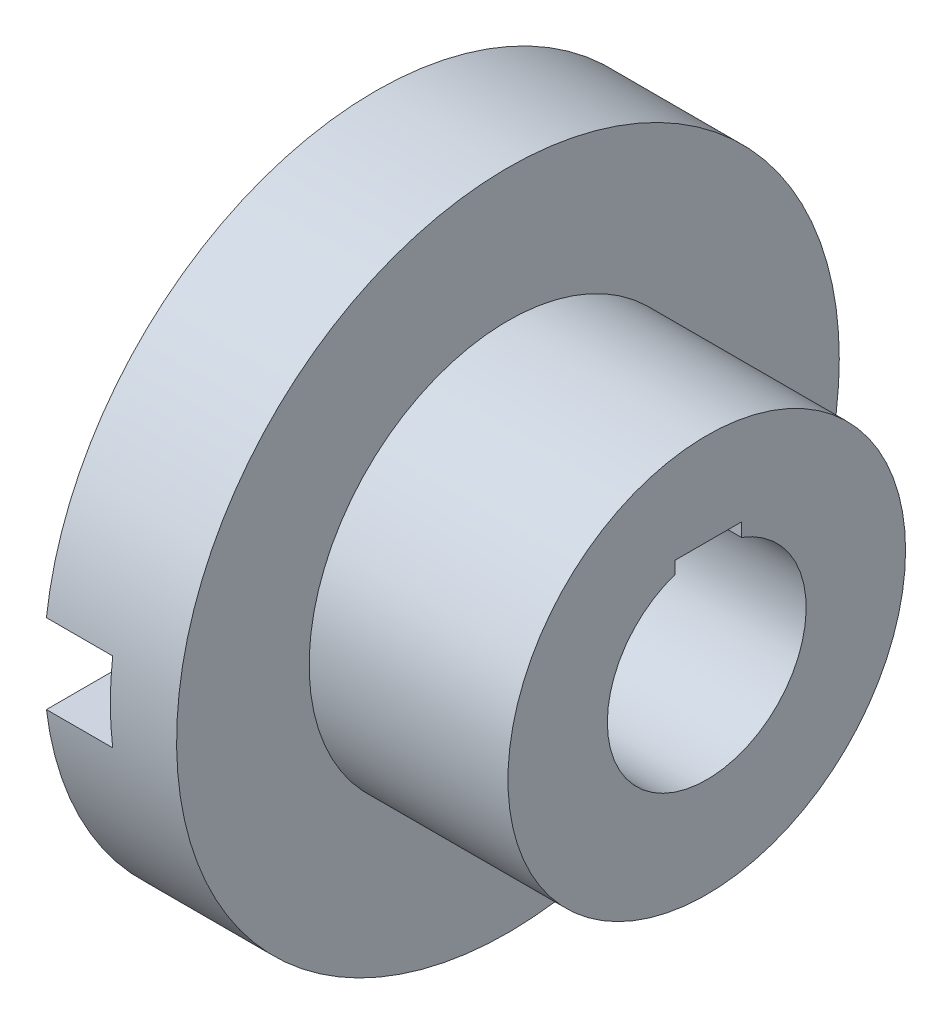
ISO-10303-21;
HEADER;
FILE_DESCRIPTION(('STEP AP214'),'2;1');
FILE_NAME('part.step','',(''),(''),'','','');
FILE_SCHEMA(('AUTOMOTIVE_DESIGN { 1 0 10303 214 1 1 1 1 }'));
ENDSEC;
DATA;
#1=APPLICATION_CONTEXT('core data for automotive mechanical design processes');
#2=APPLICATION_PROTOCOL_DEFINITION('international standard','automotive_design',2000,#1);
#3=PRODUCT_CONTEXT('',#1,'mechanical');
#4=PRODUCT('Part','Part','',(#3));
#5=PRODUCT_RELATED_PRODUCT_CATEGORY('part','',(#4));
#6=PRODUCT_DEFINITION_FORMATION('','',#4);
#7=PRODUCT_DEFINITION_CONTEXT('part definition',#1,'design');
#8=PRODUCT_DEFINITION('design','',#6,#7);
#9=PRODUCT_DEFINITION_SHAPE('','',#8);
#10=(LENGTH_UNIT() NAMED_UNIT(*) SI_UNIT(.MILLI.,.METRE.));
#11=(NAMED_UNIT(*) PLANE_ANGLE_UNIT() SI_UNIT($,.RADIAN.));
#12=(NAMED_UNIT(*) SI_UNIT($,.STERADIAN.) SOLID_ANGLE_UNIT());
#13=UNCERTAINTY_MEASURE_WITH_UNIT(LENGTH_MEASURE(1.E-05),#10,'distance_accuracy_value','');
#14=(GEOMETRIC_REPRESENTATION_CONTEXT(3) GLOBAL_UNCERTAINTY_ASSIGNED_CONTEXT((#13)) GLOBAL_UNIT_ASSIGNED_CONTEXT((#10,
#11,#12)) REPRESENTATION_CONTEXT('',''));
#15=CARTESIAN_POINT('',(0.,0.,0.));
#16=DIRECTION('',(0.,0.,1.));
#17=DIRECTION('',(1.,0.,0.));
#18=AXIS2_PLACEMENT_3D('',#15,#16,#17);
#19=CARTESIAN_POINT('',(20.,0.,0.));
#20=DIRECTION('',(-1.,0.,0.));
#21=DIRECTION('',(0.,0.,1.));
#22=AXIS2_PLACEMENT_3D('',#19,#20,#21);
#23=CYLINDRICAL_SURFACE('',#22,50.);
#24=CARTESIAN_POINT('',(20.,0.,0.));
#25=DIRECTION('',(1.,0.,0.));
#26=DIRECTION('',(0.,0.,-1.));
#27=AXIS2_PLACEMENT_3D('',#24,#25,#26);
#28=CIRCLE('',#27,50.);
#29=CARTESIAN_POINT('',(20.,0.,-50.));
#30=VERTEX_POINT('',#29);
#31=EDGE_CURVE('E47',#30,#30,#28,.T.);
#32=ORIENTED_EDGE('',*,*,#31,.F.);
#33=EDGE_LOOP('',(#32));
#34=FACE_BOUND('',#33,.T.);
#35=DIRECTION('',(-1.,0.,0.));
#36=VECTOR('',#35,1.);
#37=CARTESIAN_POINT('',(10.,6.,49.6386945839634));
#38=LINE('',#37,#36);
#39=CARTESIAN_POINT('',(10.,6.,49.6386945839634));
#40=VERTEX_POINT('',#39);
#41=CARTESIAN_POINT('',(0.,6.,49.6386945839634));
#42=VERTEX_POINT('',#41);
#43=EDGE_CURVE('E153',#40,#42,#38,.T.);
#44=ORIENTED_EDGE('',*,*,#43,.F.);
#45=CARTESIAN_POINT('',(10.,0.,0.));
#46=DIRECTION('',(-1.,0.,0.));
#47=DIRECTION('',(0.,0.,1.));
#48=AXIS2_PLACEMENT_3D('',#45,#46,#47);
#49=CIRCLE('',#48,50.);
#50=CARTESIAN_POINT('',(10.,-6.,49.6386945839634));
#51=VERTEX_POINT('',#50);
#52=EDGE_CURVE('E138',#51,#40,#49,.T.);
#53=ORIENTED_EDGE('',*,*,#52,.F.);
#54=DIRECTION('',(-1.,0.,0.));
#55=VECTOR('',#54,1.);
#56=CARTESIAN_POINT('',(10.,-6.,49.6386945839634));
#57=LINE('',#56,#55);
#58=CARTESIAN_POINT('',(0.,-6.,49.6386945839634));
#59=VERTEX_POINT('',#58);
#60=EDGE_CURVE('E136',#51,#59,#57,.T.);
#61=ORIENTED_EDGE('',*,*,#60,.T.);
#62=CARTESIAN_POINT('',(0.,0.,0.));
#63=DIRECTION('',(1.,0.,0.));
#64=DIRECTION('',(0.,0.,-1.));
#65=AXIS2_PLACEMENT_3D('',#62,#63,#64);
#66=CIRCLE('',#65,50.);
#67=CARTESIAN_POINT('',(0.,-6.,-49.6386945839634));
#68=VERTEX_POINT('',#67);
#69=EDGE_CURVE('E217',#59,#68,#66,.T.);
#70=ORIENTED_EDGE('',*,*,#69,.T.);
#71=DIRECTION('',(-1.,0.,0.));
#72=VECTOR('',#71,1.);
#73=CARTESIAN_POINT('',(10.,-6.,-49.6386945839634));
#74=LINE('',#73,#72);
#75=CARTESIAN_POINT('',(10.,-6.,-49.6386945839634));
#76=VERTEX_POINT('',#75);
#77=EDGE_CURVE('E166',#76,#68,#74,.T.);
#78=ORIENTED_EDGE('',*,*,#77,.F.);
#79=CARTESIAN_POINT('',(10.,0.,0.));
#80=DIRECTION('',(-1.,0.,0.));
#81=DIRECTION('',(0.,0.,1.));
#82=AXIS2_PLACEMENT_3D('',#79,#80,#81);
#83=CIRCLE('',#82,50.);
#84=CARTESIAN_POINT('',(10.,6.,-49.6386945839634));
#85=VERTEX_POINT('',#84);
#86=EDGE_CURVE('E158',#85,#76,#83,.T.);
#87=ORIENTED_EDGE('',*,*,#86,.F.);
#88=DIRECTION('',(-1.,0.,0.));
#89=VECTOR('',#88,1.);
#90=CARTESIAN_POINT('',(10.,6.,-49.6386945839634));
#91=LINE('',#90,#89);
#92=CARTESIAN_POINT('',(0.,6.,-49.6386945839634));
#93=VERTEX_POINT('',#92);
#94=EDGE_CURVE('E171',#85,#93,#91,.T.);
#95=ORIENTED_EDGE('',*,*,#94,.T.);
#96=EDGE_CURVE('E42',#93,#42,#66,.T.);
#97=ORIENTED_EDGE('',*,*,#96,.T.);
#98=EDGE_LOOP('',(#44,#53,#61,#70,#78,#87,#95,#97));
#99=FACE_BOUND('',#98,.T.);
#100=ADVANCED_FACE('F39',(#34,#99),#23,.T.);
#101=CARTESIAN_POINT('',(0.,0.,0.));
#102=DIRECTION('',(1.,0.,0.));
#103=DIRECTION('',(0.,0.,-1.));
#104=AXIS2_PLACEMENT_3D('',#101,#102,#103);
#105=PLANE('',#104);
#106=DIRECTION('',(0.,0.,1.));
#107=VECTOR('',#106,1.);
#108=CARTESIAN_POINT('',(0.,6.,0.));
#109=LINE('',#108,#107);
#110=CARTESIAN_POINT('',(0.,6.,13.7477270848675));
#111=VERTEX_POINT('',#110);
#112=EDGE_CURVE('E145',#111,#42,#109,.T.);
#113=ORIENTED_EDGE('',*,*,#112,.T.);
#114=ORIENTED_EDGE('',*,*,#96,.F.);
#115=DIRECTION('',(0.,0.,1.));
#116=VECTOR('',#115,1.);
#117=CARTESIAN_POINT('',(0.,6.,0.));
#118=LINE('',#117,#116);
#119=CARTESIAN_POINT('',(0.,6.,-13.7477270848675));
#120=VERTEX_POINT('',#119);
#121=EDGE_CURVE('E160',#93,#120,#118,.T.);
#122=ORIENTED_EDGE('',*,*,#121,.T.);
#123=CARTESIAN_POINT('',(0.,0.,0.));
#124=DIRECTION('',(-1.,0.,0.));
#125=DIRECTION('',(0.,0.,1.));
#126=AXIS2_PLACEMENT_3D('',#123,#124,#125);
#127=CIRCLE('',#126,15.);
#128=CARTESIAN_POINT('',(0.,14.0574626504699,-5.23333008997562));
#129=VERTEX_POINT('',#128);
#130=EDGE_CURVE('E186',#129,#120,#127,.T.);
#131=ORIENTED_EDGE('',*,*,#130,.F.);
#132=DIRECTION('',(0.,-1.,0.));
#133=VECTOR('',#132,1.);
#134=CARTESIAN_POINT('',(0.,16.0818940330038,-5.23333008997562));
#135=LINE('',#134,#133);
#136=CARTESIAN_POINT('',(0.,16.0818940330038,-5.23333008997562));
#137=VERTEX_POINT('',#136);
#138=EDGE_CURVE('E190',#137,#129,#135,.T.);
#139=ORIENTED_EDGE('',*,*,#138,.F.);
#140=DIRECTION('',(0.,0.,-1.));
#141=VECTOR('',#140,1.);
#142=CARTESIAN_POINT('',(0.,16.0818940330038,-5.23333008997562));
#143=LINE('',#142,#141);
#144=CARTESIAN_POINT('',(0.,16.0818940330038,4.76666991002438));
#145=VERTEX_POINT('',#144);
#146=EDGE_CURVE('E180',#145,#137,#143,.T.);
#147=ORIENTED_EDGE('',*,*,#146,.F.);
#148=DIRECTION('',(0.,1.,0.));
#149=VECTOR('',#148,1.);
#150=CARTESIAN_POINT('',(0.,16.0818940330038,4.76666991002438));
#151=LINE('',#150,#149);
#152=CARTESIAN_POINT('',(0.,14.2224772092933,4.76666991002438));
#153=VERTEX_POINT('',#152);
#154=EDGE_CURVE('E183',#153,#145,#151,.T.);
#155=ORIENTED_EDGE('',*,*,#154,.F.);
#156=EDGE_CURVE('E189',#111,#153,#127,.T.);
#157=ORIENTED_EDGE('',*,*,#156,.F.);
#158=EDGE_LOOP('',(#113,#114,#122,#131,#139,#147,#155,#157));
#159=FACE_BOUND('',#158,.T.);
#160=ADVANCED_FACE('F241',(#159),#105,.F.);
#161=ORIENTED_EDGE('',*,*,#69,.F.);
#162=DIRECTION('',(0.,0.,1.));
#163=VECTOR('',#162,1.);
#164=CARTESIAN_POINT('',(0.,-6.,0.));
#165=LINE('',#164,#163);
#166=CARTESIAN_POINT('',(0.,-6.,13.7477270848675));
#167=VERTEX_POINT('',#166);
#168=EDGE_CURVE('E174',#167,#59,#165,.T.);
#169=ORIENTED_EDGE('',*,*,#168,.F.);
#170=CARTESIAN_POINT('',(0.,-6.,-13.7477270848675));
#171=VERTEX_POINT('',#170);
#172=EDGE_CURVE('E151',#171,#167,#127,.T.);
#173=ORIENTED_EDGE('',*,*,#172,.F.);
#174=DIRECTION('',(0.,0.,1.));
#175=VECTOR('',#174,1.);
#176=CARTESIAN_POINT('',(0.,-6.,0.));
#177=LINE('',#176,#175);
#178=EDGE_CURVE('E167',#68,#171,#177,.T.);
#179=ORIENTED_EDGE('',*,*,#178,.F.);
#180=EDGE_LOOP('',(#161,#169,#173,#179));
#181=FACE_BOUND('',#180,.T.);
#182=ADVANCED_FACE('F231',(#181),#105,.F.);
#183=CARTESIAN_POINT('',(93.1981959887086,0.,0.));
#184=DIRECTION('',(-1.,0.,0.));
#185=DIRECTION('',(0.,0.,1.));
#186=AXIS2_PLACEMENT_3D('',#183,#184,#185);
#187=CYLINDRICAL_SURFACE('',#186,15.);
#188=DIRECTION('',(-1.,0.,0.));
#189=VECTOR('',#188,1.);
#190=CARTESIAN_POINT('',(10.,6.,13.7477270848675));
#191=LINE('',#190,#189);
#192=CARTESIAN_POINT('',(9.99999999999999,6.,13.7477270848675));
#193=VERTEX_POINT('',#192);
#194=EDGE_CURVE('E193',#193,#111,#191,.T.);
#195=ORIENTED_EDGE('',*,*,#194,.T.);
#196=ORIENTED_EDGE('',*,*,#156,.T.);
#197=DIRECTION('',(-1.,0.,0.));
#198=VECTOR('',#197,1.);
#199=CARTESIAN_POINT('',(93.1981959887086,14.2224772092933,4.76666991002438));
#200=LINE('',#199,#198);
#201=CARTESIAN_POINT('',(50.,14.2224772092933,4.76666991002438));
#202=VERTEX_POINT('',#201);
#203=EDGE_CURVE('E196',#202,#153,#200,.T.);
#204=ORIENTED_EDGE('',*,*,#203,.F.);
#205=CARTESIAN_POINT('',(50.,0.,0.));
#206=DIRECTION('',(1.,0.,0.));
#207=DIRECTION('',(0.,0.,-1.));
#208=AXIS2_PLACEMENT_3D('',#205,#206,#207);
#209=CIRCLE('',#208,15.);
#210=CARTESIAN_POINT('',(50.,14.0574626504699,-5.23333008997562));
#211=VERTEX_POINT('',#210);
#212=EDGE_CURVE('E182',#211,#202,#209,.F.);
#213=ORIENTED_EDGE('',*,*,#212,.F.);
#214=DIRECTION('',(-1.,0.,0.));
#215=VECTOR('',#214,1.);
#216=CARTESIAN_POINT('',(93.1981959887086,14.0574626504699,-5.23333008997562));
#217=LINE('',#216,#215);
#218=EDGE_CURVE('E200',#211,#129,#217,.T.);
#219=ORIENTED_EDGE('',*,*,#218,.T.);
#220=ORIENTED_EDGE('',*,*,#130,.T.);
#221=DIRECTION('',(-1.,0.,0.));
#222=VECTOR('',#221,1.);
#223=CARTESIAN_POINT('',(10.,6.,-13.7477270848675));
#224=LINE('',#223,#222);
#225=CARTESIAN_POINT('',(10.,6.,-13.7477270848675));
#226=VERTEX_POINT('',#225);
#227=EDGE_CURVE('E175',#226,#120,#224,.T.);
#228=ORIENTED_EDGE('',*,*,#227,.F.);
#229=CARTESIAN_POINT('',(10.,0.,0.));
#230=DIRECTION('',(-1.,0.,0.));
#231=DIRECTION('',(0.,0.,1.));
#232=AXIS2_PLACEMENT_3D('',#229,#230,#231);
#233=CIRCLE('',#232,15.);
#234=CARTESIAN_POINT('',(9.99999999999999,-6.,-13.7477270848675));
#235=VERTEX_POINT('',#234);
#236=EDGE_CURVE('E162',#235,#226,#233,.F.);
#237=ORIENTED_EDGE('',*,*,#236,.F.);
#238=DIRECTION('',(-1.,0.,0.));
#239=VECTOR('',#238,1.);
#240=CARTESIAN_POINT('',(10.,-6.,-13.7477270848675));
#241=LINE('',#240,#239);
#242=EDGE_CURVE('E177',#235,#171,#241,.T.);
#243=ORIENTED_EDGE('',*,*,#242,.T.);
#244=ORIENTED_EDGE('',*,*,#172,.T.);
#245=DIRECTION('',(-1.,0.,0.));
#246=VECTOR('',#245,1.);
#247=CARTESIAN_POINT('',(10.,-6.,13.7477270848675));
#248=LINE('',#247,#246);
#249=CARTESIAN_POINT('',(10.,-6.,13.7477270848675));
#250=VERTEX_POINT('',#249);
#251=EDGE_CURVE('E133',#250,#167,#248,.T.);
#252=ORIENTED_EDGE('',*,*,#251,.F.);
#253=CARTESIAN_POINT('',(10.,0.,0.));
#254=DIRECTION('',(-1.,0.,0.));
#255=DIRECTION('',(0.,0.,1.));
#256=AXIS2_PLACEMENT_3D('',#253,#254,#255);
#257=CIRCLE('',#256,15.);
#258=EDGE_CURVE('E139',#193,#250,#257,.F.);
#259=ORIENTED_EDGE('',*,*,#258,.F.);
#260=EDGE_LOOP('',(#195,#196,#204,#213,#219,#220,#228,#237,#243,#244,#252,#259));
#261=FACE_BOUND('',#260,.T.);
#262=ADVANCED_FACE('F148',(#261),#187,.F.);
#263=CARTESIAN_POINT('',(20.,0.,0.));
#264=DIRECTION('',(1.,0.,0.));
#265=DIRECTION('',(0.,0.,-1.));
#266=AXIS2_PLACEMENT_3D('',#263,#264,#265);
#267=PLANE('',#266);
#268=CARTESIAN_POINT('',(20.,0.,0.));
#269=DIRECTION('',(1.,0.,0.));
#270=DIRECTION('',(0.,0.,-1.));
#271=AXIS2_PLACEMENT_3D('',#268,#269,#270);
#272=CIRCLE('',#271,30.);
#273=CARTESIAN_POINT('',(20.,0.,-30.));
#274=VERTEX_POINT('',#273);
#275=EDGE_CURVE('E11',#274,#274,#272,.T.);
#276=ORIENTED_EDGE('',*,*,#275,.F.);
#277=EDGE_LOOP('',(#276));
#278=FACE_BOUND('',#277,.T.);
#279=ORIENTED_EDGE('',*,*,#31,.T.);
#280=EDGE_LOOP('',(#279));
#281=FACE_BOUND('',#280,.T.);
#282=ADVANCED_FACE('F273',(#278,#281),#267,.T.);
#283=CARTESIAN_POINT('',(50.,0.,0.));
#284=DIRECTION('',(-1.,0.,0.));
#285=DIRECTION('',(0.,0.,1.));
#286=AXIS2_PLACEMENT_3D('',#283,#284,#285);
#287=CYLINDRICAL_SURFACE('',#286,30.);
#288=CARTESIAN_POINT('',(50.,0.,0.));
#289=DIRECTION('',(1.,0.,0.));
#290=DIRECTION('',(0.,0.,-1.));
#291=AXIS2_PLACEMENT_3D('',#288,#289,#290);
#292=CIRCLE('',#291,30.);
#293=CARTESIAN_POINT('',(50.,0.,-30.));
#294=VERTEX_POINT('',#293);
#295=EDGE_CURVE('E215',#294,#294,#292,.T.);
#296=ORIENTED_EDGE('',*,*,#295,.F.);
#297=EDGE_LOOP('',(#296));
#298=FACE_BOUND('',#297,.T.);
#299=ORIENTED_EDGE('',*,*,#275,.T.);
#300=EDGE_LOOP('',(#299));
#301=FACE_BOUND('',#300,.T.);
#302=ADVANCED_FACE('F267',(#298,#301),#287,.T.);
#303=CARTESIAN_POINT('',(50.,0.,0.));
#304=DIRECTION('',(1.,0.,0.));
#305=DIRECTION('',(0.,0.,-1.));
#306=AXIS2_PLACEMENT_3D('',#303,#304,#305);
#307=PLANE('',#306);
#308=ORIENTED_EDGE('',*,*,#212,.T.);
#309=DIRECTION('',(0.,1.,0.));
#310=VECTOR('',#309,1.);
#311=CARTESIAN_POINT('',(50.,16.0818940330038,4.76666991002438));
#312=LINE('',#311,#310);
#313=CARTESIAN_POINT('',(50.,16.0818940330038,4.76666991002438));
#314=VERTEX_POINT('',#313);
#315=EDGE_CURVE('E206',#202,#314,#312,.T.);
#316=ORIENTED_EDGE('',*,*,#315,.T.);
#317=DIRECTION('',(0.,0.,-1.));
#318=VECTOR('',#317,1.);
#319=CARTESIAN_POINT('',(50.,16.0818940330038,-5.23333008997562));
#320=LINE('',#319,#318);
#321=CARTESIAN_POINT('',(50.,16.0818940330038,-5.23333008997562));
#322=VERTEX_POINT('',#321);
#323=EDGE_CURVE('E202',#314,#322,#320,.T.);
#324=ORIENTED_EDGE('',*,*,#323,.T.);
#325=DIRECTION('',(0.,-1.,0.));
#326=VECTOR('',#325,1.);
#327=CARTESIAN_POINT('',(50.,16.0818940330038,-5.23333008997562));
#328=LINE('',#327,#326);
#329=EDGE_CURVE('E197',#322,#211,#328,.T.);
#330=ORIENTED_EDGE('',*,*,#329,.T.);
#331=EDGE_LOOP('',(#308,#316,#324,#330));
#332=FACE_BOUND('',#331,.T.);
#333=ORIENTED_EDGE('',*,*,#295,.T.);
#334=EDGE_LOOP('',(#333));
#335=FACE_BOUND('',#334,.T.);
#336=ADVANCED_FACE('F264',(#332,#335),#307,.T.);
#337=CARTESIAN_POINT('',(93.1981959887086,16.0818940330038,4.76666991002438));
#338=DIRECTION('',(0.,0.,1.));
#339=DIRECTION('',(1.,0.,0.));
#340=AXIS2_PLACEMENT_3D('',#337,#338,#339);
#341=PLANE('',#340);
#342=ORIENTED_EDGE('',*,*,#203,.T.);
#343=ORIENTED_EDGE('',*,*,#154,.T.);
#344=DIRECTION('',(-1.,0.,0.));
#345=VECTOR('',#344,1.);
#346=CARTESIAN_POINT('',(93.1981959887086,16.0818940330038,4.76666991002438));
#347=LINE('',#346,#345);
#348=EDGE_CURVE('E205',#314,#145,#347,.T.);
#349=ORIENTED_EDGE('',*,*,#348,.F.);
#350=ORIENTED_EDGE('',*,*,#315,.F.);
#351=EDGE_LOOP('',(#342,#343,#349,#350));
#352=FACE_BOUND('',#351,.T.);
#353=ADVANCED_FACE('F254',(#352),#341,.F.);
#354=CARTESIAN_POINT('',(93.1981959887086,16.0818940330038,-5.23333008997562));
#355=DIRECTION('',(0.,1.,0.));
#356=DIRECTION('',(0.,0.,1.));
#357=AXIS2_PLACEMENT_3D('',#354,#355,#356);
#358=PLANE('',#357);
#359=ORIENTED_EDGE('',*,*,#348,.T.);
#360=ORIENTED_EDGE('',*,*,#146,.T.);
#361=DIRECTION('',(-1.,0.,0.));
#362=VECTOR('',#361,1.);
#363=CARTESIAN_POINT('',(93.1981959887086,16.0818940330038,-5.23333008997562));
#364=LINE('',#363,#362);
#365=EDGE_CURVE('E201',#322,#137,#364,.T.);
#366=ORIENTED_EDGE('',*,*,#365,.F.);
#367=ORIENTED_EDGE('',*,*,#323,.F.);
#368=EDGE_LOOP('',(#359,#360,#366,#367));
#369=FACE_BOUND('',#368,.T.);
#370=ADVANCED_FACE('F260',(#369),#358,.F.);
#371=CARTESIAN_POINT('',(93.1981959887086,16.0818940330038,-5.23333008997562));
#372=DIRECTION('',(0.,0.,-1.));
#373=DIRECTION('',(-1.,0.,0.));
#374=AXIS2_PLACEMENT_3D('',#371,#372,#373);
#375=PLANE('',#374);
#376=ORIENTED_EDGE('',*,*,#365,.T.);
#377=ORIENTED_EDGE('',*,*,#138,.T.);
#378=ORIENTED_EDGE('',*,*,#218,.F.);
#379=ORIENTED_EDGE('',*,*,#329,.F.);
#380=EDGE_LOOP('',(#376,#377,#378,#379));
#381=FACE_BOUND('',#380,.T.);
#382=ADVANCED_FACE('F262',(#381),#375,.F.);
#383=CARTESIAN_POINT('',(10.,6.,0.));
#384=DIRECTION('',(0.,-1.,0.));
#385=DIRECTION('',(0.,0.,-1.));
#386=AXIS2_PLACEMENT_3D('',#383,#384,#385);
#387=PLANE('',#386);
#388=ORIENTED_EDGE('',*,*,#121,.F.);
#389=ORIENTED_EDGE('',*,*,#94,.F.);
#390=DIRECTION('',(0.,0.,1.));
#391=VECTOR('',#390,1.);
#392=CARTESIAN_POINT('',(10.,6.,0.));
#393=LINE('',#392,#391);
#394=EDGE_CURVE('E164',#85,#226,#393,.T.);
#395=ORIENTED_EDGE('',*,*,#394,.T.);
#396=ORIENTED_EDGE('',*,*,#227,.T.);
#397=EDGE_LOOP('',(#388,#389,#395,#396));
#398=FACE_BOUND('',#397,.T.);
#399=ADVANCED_FACE('F303',(#398),#387,.T.);
#400=CARTESIAN_POINT('',(10.,-6.,0.));
#401=DIRECTION('',(0.,-1.,0.));
#402=DIRECTION('',(0.,0.,-1.));
#403=AXIS2_PLACEMENT_3D('',#400,#401,#402);
#404=PLANE('',#403);
#405=ORIENTED_EDGE('',*,*,#178,.T.);
#406=ORIENTED_EDGE('',*,*,#242,.F.);
#407=DIRECTION('',(0.,0.,1.));
#408=VECTOR('',#407,1.);
#409=CARTESIAN_POINT('',(10.,-6.,0.));
#410=LINE('',#409,#408);
#411=EDGE_CURVE('E63',#76,#235,#410,.T.);
#412=ORIENTED_EDGE('',*,*,#411,.F.);
#413=ORIENTED_EDGE('',*,*,#77,.T.);
#414=EDGE_LOOP('',(#405,#406,#412,#413));
#415=FACE_BOUND('',#414,.T.);
#416=ADVANCED_FACE('F233',(#415),#404,.F.);
#417=CARTESIAN_POINT('',(10.,0.,0.));
#418=DIRECTION('',(-1.,0.,0.));
#419=DIRECTION('',(0.,0.,1.));
#420=AXIS2_PLACEMENT_3D('',#417,#418,#419);
#421=PLANE('',#420);
#422=ORIENTED_EDGE('',*,*,#86,.T.);
#423=ORIENTED_EDGE('',*,*,#411,.T.);
#424=ORIENTED_EDGE('',*,*,#236,.T.);
#425=ORIENTED_EDGE('',*,*,#394,.F.);
#426=EDGE_LOOP('',(#422,#423,#424,#425));
#427=FACE_BOUND('',#426,.T.);
#428=ADVANCED_FACE('F237',(#427),#421,.T.);
#429=CARTESIAN_POINT('',(10.,6.,0.));
#430=DIRECTION('',(0.,-1.,0.));
#431=DIRECTION('',(0.,0.,-1.));
#432=AXIS2_PLACEMENT_3D('',#429,#430,#431);
#433=PLANE('',#432);
#434=ORIENTED_EDGE('',*,*,#112,.F.);
#435=ORIENTED_EDGE('',*,*,#194,.F.);
#436=DIRECTION('',(0.,0.,1.));
#437=VECTOR('',#436,1.);
#438=CARTESIAN_POINT('',(10.,6.,0.));
#439=LINE('',#438,#437);
#440=EDGE_CURVE('E55',#193,#40,#439,.T.);
#441=ORIENTED_EDGE('',*,*,#440,.T.);
#442=ORIENTED_EDGE('',*,*,#43,.T.);
#443=EDGE_LOOP('',(#434,#435,#441,#442));
#444=FACE_BOUND('',#443,.T.);
#445=ADVANCED_FACE('F249',(#444),#433,.T.);
#446=CARTESIAN_POINT('',(10.,-6.,0.));
#447=DIRECTION('',(0.,-1.,0.));
#448=DIRECTION('',(0.,0.,-1.));
#449=AXIS2_PLACEMENT_3D('',#446,#447,#448);
#450=PLANE('',#449);
#451=ORIENTED_EDGE('',*,*,#168,.T.);
#452=ORIENTED_EDGE('',*,*,#60,.F.);
#453=DIRECTION('',(0.,0.,1.));
#454=VECTOR('',#453,1.);
#455=CARTESIAN_POINT('',(10.,-6.,0.));
#456=LINE('',#455,#454);
#457=EDGE_CURVE('E130',#250,#51,#456,.T.);
#458=ORIENTED_EDGE('',*,*,#457,.F.);
#459=ORIENTED_EDGE('',*,*,#251,.T.);
#460=EDGE_LOOP('',(#451,#452,#458,#459));
#461=FACE_BOUND('',#460,.T.);
#462=ADVANCED_FACE('F131',(#461),#450,.F.);
#463=CARTESIAN_POINT('',(10.,0.,0.));
#464=DIRECTION('',(-1.,0.,0.));
#465=DIRECTION('',(0.,0.,1.));
#466=AXIS2_PLACEMENT_3D('',#463,#464,#465);
#467=PLANE('',#466);
#468=ORIENTED_EDGE('',*,*,#258,.T.);
#469=ORIENTED_EDGE('',*,*,#457,.T.);
#470=ORIENTED_EDGE('',*,*,#52,.T.);
#471=ORIENTED_EDGE('',*,*,#440,.F.);
#472=EDGE_LOOP('',(#468,#469,#470,#471));
#473=FACE_BOUND('',#472,.T.);
#474=ADVANCED_FACE('F142',(#473),#467,.T.);
#475=CLOSED_SHELL('',(#100,#160,#182,#262,#282,#302,#336,#353,#370,#382,#399,#416,#428,#445,
#462,#474));
#476=MANIFOLD_SOLID_BREP('B2',#475);
#477=ADVANCED_BREP_SHAPE_REPRESENTATION('',(#18,#476),#14);
#478=SHAPE_DEFINITION_REPRESENTATION(#9,#477);
ENDSEC;
END-ISO-10303-21;
